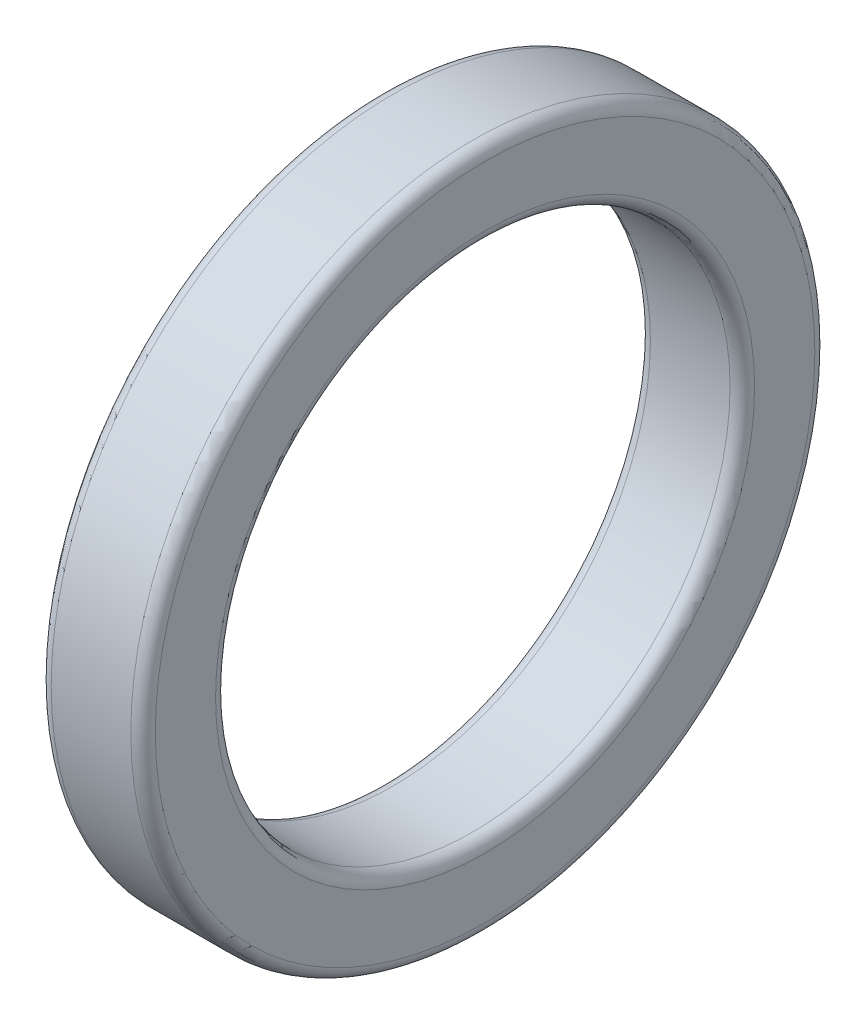
ISO-10303-21;
HEADER;
FILE_DESCRIPTION(('STEP AP214'),'2;1');
FILE_NAME('part.step','',(''),(''),'','','');
FILE_SCHEMA(('AUTOMOTIVE_DESIGN { 1 0 10303 214 1 1 1 1 }'));
ENDSEC;
DATA;
#1=APPLICATION_CONTEXT('core data for automotive mechanical design processes');
#2=APPLICATION_PROTOCOL_DEFINITION('international standard','automotive_design',2000,#1);
#3=PRODUCT_CONTEXT('',#1,'mechanical');
#4=PRODUCT('Part','Part','',(#3));
#5=PRODUCT_RELATED_PRODUCT_CATEGORY('part','',(#4));
#6=PRODUCT_DEFINITION_FORMATION('','',#4);
#7=PRODUCT_DEFINITION_CONTEXT('part definition',#1,'design');
#8=PRODUCT_DEFINITION('design','',#6,#7);
#9=PRODUCT_DEFINITION_SHAPE('','',#8);
#10=(LENGTH_UNIT() NAMED_UNIT(*) SI_UNIT(.MILLI.,.METRE.));
#11=(NAMED_UNIT(*) PLANE_ANGLE_UNIT() SI_UNIT($,.RADIAN.));
#12=(NAMED_UNIT(*) SI_UNIT($,.STERADIAN.) SOLID_ANGLE_UNIT());
#13=UNCERTAINTY_MEASURE_WITH_UNIT(LENGTH_MEASURE(1.E-05),#10,'distance_accuracy_value','');
#14=(GEOMETRIC_REPRESENTATION_CONTEXT(3) GLOBAL_UNCERTAINTY_ASSIGNED_CONTEXT((#13)) GLOBAL_UNIT_ASSIGNED_CONTEXT((#10,
#11,#12)) REPRESENTATION_CONTEXT('',''));
#15=CARTESIAN_POINT('',(0.,0.,0.));
#16=DIRECTION('',(0.,0.,1.));
#17=DIRECTION('',(1.,0.,0.));
#18=AXIS2_PLACEMENT_3D('',#15,#16,#17);
#19=CARTESIAN_POINT('',(42.5,0.,0.));
#20=DIRECTION('',(1.,0.,0.));
#21=DIRECTION('',(0.,0.,-1.));
#22=AXIS2_PLACEMENT_3D('',#19,#20,#21);
#23=PLANE('',#22);
#24=CARTESIAN_POINT('',(42.5,0.,0.));
#25=DIRECTION('',(1.,0.,0.));
#26=DIRECTION('',(0.,0.,-1.));
#27=AXIS2_PLACEMENT_3D('',#24,#25,#26);
#28=CIRCLE('',#27,220.);
#29=CARTESIAN_POINT('',(42.5,0.,-220.));
#30=VERTEX_POINT('',#29);
#31=EDGE_CURVE('E10',#30,#30,#28,.F.);
#32=ORIENTED_EDGE('',*,*,#31,.T.);
#33=EDGE_LOOP('',(#32));
#34=FACE_BOUND('',#33,.T.);
#35=CARTESIAN_POINT('',(42.5,0.,0.));
#36=DIRECTION('',(1.,0.,0.));
#37=DIRECTION('',(0.,0.,-1.));
#38=AXIS2_PLACEMENT_3D('',#35,#36,#37);
#39=CIRCLE('',#38,269.2);
#40=CARTESIAN_POINT('',(42.5,0.,-269.2));
#41=VERTEX_POINT('',#40);
#42=EDGE_CURVE('E48',#41,#41,#39,.T.);
#43=ORIENTED_EDGE('',*,*,#42,.T.);
#44=EDGE_LOOP('',(#43));
#45=FACE_BOUND('',#44,.T.);
#46=ADVANCED_FACE('F41',(#34,#45),#23,.T.);
#47=CARTESIAN_POINT('',(-42.5,0.,0.));
#48=DIRECTION('',(1.,0.,0.));
#49=DIRECTION('',(0.,0.,-1.));
#50=AXIS2_PLACEMENT_3D('',#47,#48,#49);
#51=PLANE('',#50);
#52=CARTESIAN_POINT('',(-42.5,0.,0.));
#53=DIRECTION('',(1.,0.,0.));
#54=DIRECTION('',(0.,0.,-1.));
#55=AXIS2_PLACEMENT_3D('',#52,#53,#54);
#56=CIRCLE('',#55,220.);
#57=CARTESIAN_POINT('',(-42.5,0.,-220.));
#58=VERTEX_POINT('',#57);
#59=EDGE_CURVE('E67',#58,#58,#56,.T.);
#60=ORIENTED_EDGE('',*,*,#59,.T.);
#61=EDGE_LOOP('',(#60));
#62=FACE_BOUND('',#61,.T.);
#63=CARTESIAN_POINT('',(-42.5,0.,0.));
#64=DIRECTION('',(1.,0.,0.));
#65=DIRECTION('',(0.,0.,-1.));
#66=AXIS2_PLACEMENT_3D('',#63,#64,#65);
#67=CIRCLE('',#66,269.2);
#68=CARTESIAN_POINT('',(-42.5,0.,-269.2));
#69=VERTEX_POINT('',#68);
#70=EDGE_CURVE('E70',#69,#69,#67,.F.);
#71=ORIENTED_EDGE('',*,*,#70,.T.);
#72=EDGE_LOOP('',(#71));
#73=FACE_BOUND('',#72,.T.);
#74=ADVANCED_FACE('F74',(#62,#73),#51,.F.);
#75=CARTESIAN_POINT('',(42.5,0.,0.));
#76=DIRECTION('',(-1.,0.,0.));
#77=DIRECTION('',(0.,0.,1.));
#78=AXIS2_PLACEMENT_3D('',#75,#76,#77);
#79=CYLINDRICAL_SURFACE('',#78,279.2);
#80=CARTESIAN_POINT('',(-32.5,0.,0.));
#81=DIRECTION('',(1.,0.,0.));
#82=DIRECTION('',(0.,0.,-1.));
#83=AXIS2_PLACEMENT_3D('',#80,#81,#82);
#84=CIRCLE('',#83,279.2);
#85=CARTESIAN_POINT('',(-32.5,0.,-279.2));
#86=VERTEX_POINT('',#85);
#87=EDGE_CURVE('E52',#86,#86,#84,.T.);
#88=ORIENTED_EDGE('',*,*,#87,.T.);
#89=EDGE_LOOP('',(#88));
#90=FACE_BOUND('',#89,.T.);
#91=CARTESIAN_POINT('',(32.5,0.,0.));
#92=DIRECTION('',(1.,0.,0.));
#93=DIRECTION('',(0.,0.,-1.));
#94=AXIS2_PLACEMENT_3D('',#91,#92,#93);
#95=CIRCLE('',#94,279.2);
#96=CARTESIAN_POINT('',(32.5,0.,-279.2));
#97=VERTEX_POINT('',#96);
#98=EDGE_CURVE('E56',#97,#97,#95,.F.);
#99=ORIENTED_EDGE('',*,*,#98,.T.);
#100=EDGE_LOOP('',(#99));
#101=FACE_BOUND('',#100,.T.);
#102=ADVANCED_FACE('F84',(#90,#101),#79,.T.);
#103=CARTESIAN_POINT('',(42.5,0.,0.));
#104=DIRECTION('',(-1.,0.,0.));
#105=DIRECTION('',(0.,0.,1.));
#106=AXIS2_PLACEMENT_3D('',#103,#104,#105);
#107=CYLINDRICAL_SURFACE('',#106,210.);
#108=CARTESIAN_POINT('',(-32.5,0.,0.));
#109=DIRECTION('',(1.,0.,0.));
#110=DIRECTION('',(0.,0.,-1.));
#111=AXIS2_PLACEMENT_3D('',#108,#109,#110);
#112=CIRCLE('',#111,210.);
#113=CARTESIAN_POINT('',(-32.5,0.,-210.));
#114=VERTEX_POINT('',#113);
#115=EDGE_CURVE('E61',#114,#114,#112,.F.);
#116=ORIENTED_EDGE('',*,*,#115,.T.);
#117=EDGE_LOOP('',(#116));
#118=FACE_BOUND('',#117,.T.);
#119=CARTESIAN_POINT('',(32.5,0.,0.));
#120=DIRECTION('',(1.,0.,0.));
#121=DIRECTION('',(0.,0.,-1.));
#122=AXIS2_PLACEMENT_3D('',#119,#120,#121);
#123=CIRCLE('',#122,210.);
#124=CARTESIAN_POINT('',(32.5,0.,-210.));
#125=VERTEX_POINT('',#124);
#126=EDGE_CURVE('E64',#125,#125,#123,.T.);
#127=ORIENTED_EDGE('',*,*,#126,.T.);
#128=EDGE_LOOP('',(#127));
#129=FACE_BOUND('',#128,.T.);
#130=ADVANCED_FACE('F87',(#118,#129),#107,.F.);
#131=CARTESIAN_POINT('',(-32.5,0.,0.));
#132=DIRECTION('',(1.,0.,0.));
#133=DIRECTION('',(0.,0.,-1.));
#134=AXIS2_PLACEMENT_3D('',#131,#132,#133);
#135=TOROIDAL_SURFACE('',#134,220.,10.);
#136=ORIENTED_EDGE('',*,*,#115,.F.);
#137=EDGE_LOOP('',(#136));
#138=FACE_BOUND('',#137,.T.);
#139=ORIENTED_EDGE('',*,*,#59,.F.);
#140=EDGE_LOOP('',(#139));
#141=FACE_BOUND('',#140,.T.);
#142=ADVANCED_FACE('F80',(#138,#141),#135,.T.);
#143=CARTESIAN_POINT('',(-32.5,0.,0.));
#144=DIRECTION('',(1.,0.,0.));
#145=DIRECTION('',(0.,0.,-1.));
#146=AXIS2_PLACEMENT_3D('',#143,#144,#145);
#147=TOROIDAL_SURFACE('',#146,269.2,10.);
#148=ORIENTED_EDGE('',*,*,#70,.F.);
#149=EDGE_LOOP('',(#148));
#150=FACE_BOUND('',#149,.T.);
#151=ORIENTED_EDGE('',*,*,#87,.F.);
#152=EDGE_LOOP('',(#151));
#153=FACE_BOUND('',#152,.T.);
#154=ADVANCED_FACE('F76',(#150,#153),#147,.T.);
#155=CARTESIAN_POINT('',(32.5,0.,0.));
#156=DIRECTION('',(1.,0.,0.));
#157=DIRECTION('',(0.,0.,-1.));
#158=AXIS2_PLACEMENT_3D('',#155,#156,#157);
#159=TOROIDAL_SURFACE('',#158,220.,10.);
#160=ORIENTED_EDGE('',*,*,#31,.F.);
#161=EDGE_LOOP('',(#160));
#162=FACE_BOUND('',#161,.T.);
#163=ORIENTED_EDGE('',*,*,#126,.F.);
#164=EDGE_LOOP('',(#163));
#165=FACE_BOUND('',#164,.T.);
#166=ADVANCED_FACE('F79',(#162,#165),#159,.T.);
#167=CARTESIAN_POINT('',(32.5,0.,0.));
#168=DIRECTION('',(1.,0.,0.));
#169=DIRECTION('',(0.,0.,-1.));
#170=AXIS2_PLACEMENT_3D('',#167,#168,#169);
#171=TOROIDAL_SURFACE('',#170,269.2,10.);
#172=ORIENTED_EDGE('',*,*,#98,.F.);
#173=EDGE_LOOP('',(#172));
#174=FACE_BOUND('',#173,.T.);
#175=ORIENTED_EDGE('',*,*,#42,.F.);
#176=EDGE_LOOP('',(#175));
#177=FACE_BOUND('',#176,.T.);
#178=ADVANCED_FACE('F43',(#174,#177),#171,.T.);
#179=CLOSED_SHELL('',(#46,#74,#102,#130,#142,#154,#166,#178));
#180=MANIFOLD_SOLID_BREP('B2',#179);
#181=ADVANCED_BREP_SHAPE_REPRESENTATION('',(#18,#180),#14);
#182=SHAPE_DEFINITION_REPRESENTATION(#9,#181);
ENDSEC;
END-ISO-10303-21;
